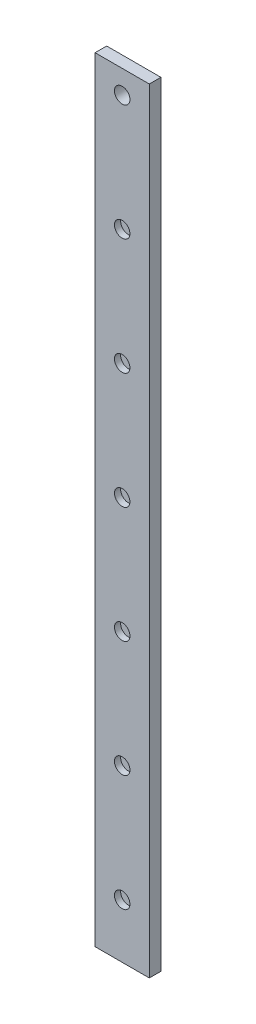
ISO-10303-21;
HEADER;
FILE_DESCRIPTION(('STEP AP214'),'2;1');
FILE_NAME('part.step','',(''),(''),'','','');
FILE_SCHEMA(('AUTOMOTIVE_DESIGN { 1 0 10303 214 1 1 1 1 }'));
ENDSEC;
DATA;
#1=APPLICATION_CONTEXT('core data for automotive mechanical design processes');
#2=APPLICATION_PROTOCOL_DEFINITION('international standard','automotive_design',2000,#1);
#3=PRODUCT_CONTEXT('',#1,'mechanical');
#4=PRODUCT('Part','Part','',(#3));
#5=PRODUCT_RELATED_PRODUCT_CATEGORY('part','',(#4));
#6=PRODUCT_DEFINITION_FORMATION('','',#4);
#7=PRODUCT_DEFINITION_CONTEXT('part definition',#1,'design');
#8=PRODUCT_DEFINITION('design','',#6,#7);
#9=PRODUCT_DEFINITION_SHAPE('','',#8);
#10=(LENGTH_UNIT() NAMED_UNIT(*) SI_UNIT(.MILLI.,.METRE.));
#11=(NAMED_UNIT(*) PLANE_ANGLE_UNIT() SI_UNIT($,.RADIAN.));
#12=(NAMED_UNIT(*) SI_UNIT($,.STERADIAN.) SOLID_ANGLE_UNIT());
#13=UNCERTAINTY_MEASURE_WITH_UNIT(LENGTH_MEASURE(1.E-05),#10,'distance_accuracy_value','');
#14=(GEOMETRIC_REPRESENTATION_CONTEXT(3) GLOBAL_UNCERTAINTY_ASSIGNED_CONTEXT((#13)) GLOBAL_UNIT_ASSIGNED_CONTEXT((#10,
#11,#12)) REPRESENTATION_CONTEXT('',''));
#15=CARTESIAN_POINT('',(0.,0.,0.));
#16=DIRECTION('',(0.,0.,1.));
#17=DIRECTION('',(1.,0.,0.));
#18=AXIS2_PLACEMENT_3D('',#15,#16,#17);
#19=CARTESIAN_POINT('',(0.,1000.,0.));
#20=DIRECTION('',(1.,0.,0.));
#21=DIRECTION('',(0.,0.,-1.));
#22=AXIS2_PLACEMENT_3D('',#19,#20,#21);
#23=PLANE('',#22);
#24=DIRECTION('',(0.,0.,1.));
#25=VECTOR('',#24,1.);
#26=CARTESIAN_POINT('',(0.,0.,0.));
#27=LINE('',#26,#25);
#28=CARTESIAN_POINT('',(0.,0.,0.));
#29=VERTEX_POINT('',#28);
#30=CARTESIAN_POINT('',(0.,0.,15.));
#31=VERTEX_POINT('',#30);
#32=EDGE_CURVE('E99',#29,#31,#27,.T.);
#33=ORIENTED_EDGE('',*,*,#32,.F.);
#34=DIRECTION('',(0.,-1.,0.));
#35=VECTOR('',#34,1.);
#36=CARTESIAN_POINT('',(0.,1000.,0.));
#37=LINE('',#36,#35);
#38=CARTESIAN_POINT('',(0.,1000.,0.));
#39=VERTEX_POINT('',#38);
#40=EDGE_CURVE('E11',#39,#29,#37,.T.);
#41=ORIENTED_EDGE('',*,*,#40,.F.);
#42=DIRECTION('',(0.,0.,1.));
#43=VECTOR('',#42,1.);
#44=CARTESIAN_POINT('',(0.,1000.,0.));
#45=LINE('',#44,#43);
#46=CARTESIAN_POINT('',(0.,1000.,15.));
#47=VERTEX_POINT('',#46);
#48=EDGE_CURVE('E93',#39,#47,#45,.T.);
#49=ORIENTED_EDGE('',*,*,#48,.T.);
#50=DIRECTION('',(0.,-1.,0.));
#51=VECTOR('',#50,1.);
#52=CARTESIAN_POINT('',(0.,1000.,15.));
#53=LINE('',#52,#51);
#54=EDGE_CURVE('E36',#47,#31,#53,.T.);
#55=ORIENTED_EDGE('',*,*,#54,.T.);
#56=EDGE_LOOP('',(#33,#41,#49,#55));
#57=FACE_BOUND('',#56,.T.);
#58=ADVANCED_FACE('F33',(#57),#23,.T.);
#59=CARTESIAN_POINT('',(0.,1000.,0.));
#60=DIRECTION('',(0.,0.,1.));
#61=DIRECTION('',(1.,0.,0.));
#62=AXIS2_PLACEMENT_3D('',#59,#60,#61);
#63=PLANE('',#62);
#64=CARTESIAN_POINT('',(-35.,970.,0.));
#65=DIRECTION('',(0.,0.,1.));
#66=DIRECTION('',(1.,0.,0.));
#67=AXIS2_PLACEMENT_3D('',#64,#65,#66);
#68=CIRCLE('',#67,10.);
#69=CARTESIAN_POINT('',(-25.,970.,0.));
#70=VERTEX_POINT('',#69);
#71=EDGE_CURVE('E103',#70,#70,#68,.T.);
#72=ORIENTED_EDGE('',*,*,#71,.T.);
#73=EDGE_LOOP('',(#72));
#74=FACE_BOUND('',#73,.T.);
#75=DIRECTION('',(-1.,0.,0.));
#76=VECTOR('',#75,1.);
#77=CARTESIAN_POINT('',(0.,0.,0.));
#78=LINE('',#77,#76);
#79=CARTESIAN_POINT('',(-70.,0.,0.));
#80=VERTEX_POINT('',#79);
#81=EDGE_CURVE('E66',#29,#80,#78,.T.);
#82=ORIENTED_EDGE('',*,*,#81,.T.);
#83=DIRECTION('',(0.,-1.,0.));
#84=VECTOR('',#83,1.);
#85=CARTESIAN_POINT('',(-70.,1000.,0.));
#86=LINE('',#85,#84);
#87=CARTESIAN_POINT('',(-70.,1000.,0.));
#88=VERTEX_POINT('',#87);
#89=EDGE_CURVE('E42',#88,#80,#86,.T.);
#90=ORIENTED_EDGE('',*,*,#89,.F.);
#91=DIRECTION('',(-1.,0.,0.));
#92=VECTOR('',#91,1.);
#93=CARTESIAN_POINT('',(0.,1000.,0.));
#94=LINE('',#93,#92);
#95=EDGE_CURVE('E83',#39,#88,#94,.T.);
#96=ORIENTED_EDGE('',*,*,#95,.F.);
#97=ORIENTED_EDGE('',*,*,#40,.T.);
#98=EDGE_LOOP('',(#82,#90,#96,#97));
#99=FACE_BOUND('',#98,.T.);
#100=ADVANCED_FACE('F110',(#74,#99),#63,.F.);
#101=CARTESIAN_POINT('',(-70.,1000.,0.));
#102=DIRECTION('',(1.,0.,0.));
#103=DIRECTION('',(0.,0.,-1.));
#104=AXIS2_PLACEMENT_3D('',#101,#102,#103);
#105=PLANE('',#104);
#106=DIRECTION('',(0.,0.,1.));
#107=VECTOR('',#106,1.);
#108=CARTESIAN_POINT('',(-70.,0.,0.));
#109=LINE('',#108,#107);
#110=CARTESIAN_POINT('',(-70.,0.,15.));
#111=VERTEX_POINT('',#110);
#112=EDGE_CURVE('E90',#80,#111,#109,.T.);
#113=ORIENTED_EDGE('',*,*,#112,.T.);
#114=DIRECTION('',(0.,-1.,0.));
#115=VECTOR('',#114,1.);
#116=CARTESIAN_POINT('',(-70.,1000.,15.));
#117=LINE('',#116,#115);
#118=CARTESIAN_POINT('',(-70.,1000.,15.));
#119=VERTEX_POINT('',#118);
#120=EDGE_CURVE('E87',#119,#111,#117,.T.);
#121=ORIENTED_EDGE('',*,*,#120,.F.);
#122=DIRECTION('',(0.,0.,1.));
#123=VECTOR('',#122,1.);
#124=CARTESIAN_POINT('',(-70.,1000.,0.));
#125=LINE('',#124,#123);
#126=EDGE_CURVE('E78',#88,#119,#125,.T.);
#127=ORIENTED_EDGE('',*,*,#126,.F.);
#128=ORIENTED_EDGE('',*,*,#89,.T.);
#129=EDGE_LOOP('',(#113,#121,#127,#128));
#130=FACE_BOUND('',#129,.T.);
#131=ADVANCED_FACE('F88',(#130),#105,.F.);
#132=CARTESIAN_POINT('',(0.,1000.,15.));
#133=DIRECTION('',(0.,0.,1.));
#134=DIRECTION('',(1.,0.,0.));
#135=AXIS2_PLACEMENT_3D('',#132,#133,#134);
#136=PLANE('',#135);
#137=CARTESIAN_POINT('',(-35.,820.,15.));
#138=DIRECTION('',(0.,0.,1.));
#139=DIRECTION('',(1.,0.,0.));
#140=AXIS2_PLACEMENT_3D('',#137,#138,#139);
#141=CIRCLE('',#140,10.);
#142=CARTESIAN_POINT('',(-25.,820.,15.));
#143=VERTEX_POINT('',#142);
#144=EDGE_CURVE('E131',#143,#143,#141,.T.);
#145=ORIENTED_EDGE('',*,*,#144,.F.);
#146=EDGE_LOOP('',(#145));
#147=FACE_BOUND('',#146,.T.);
#148=CARTESIAN_POINT('',(-34.9999999999984,670.,15.));
#149=DIRECTION('',(0.,0.,1.));
#150=DIRECTION('',(1.,0.,0.));
#151=AXIS2_PLACEMENT_3D('',#148,#149,#150);
#152=CIRCLE('',#151,10.);
#153=CARTESIAN_POINT('',(-24.9999999999984,670.,15.));
#154=VERTEX_POINT('',#153);
#155=EDGE_CURVE('E135',#154,#154,#152,.T.);
#156=ORIENTED_EDGE('',*,*,#155,.F.);
#157=EDGE_LOOP('',(#156));
#158=FACE_BOUND('',#157,.T.);
#159=CARTESIAN_POINT('',(-34.9999999999969,520.,15.));
#160=DIRECTION('',(0.,0.,1.));
#161=DIRECTION('',(1.,0.,0.));
#162=AXIS2_PLACEMENT_3D('',#159,#160,#161);
#163=CIRCLE('',#162,10.);
#164=CARTESIAN_POINT('',(-24.9999999999969,520.,15.));
#165=VERTEX_POINT('',#164);
#166=EDGE_CURVE('E139',#165,#165,#163,.T.);
#167=ORIENTED_EDGE('',*,*,#166,.F.);
#168=EDGE_LOOP('',(#167));
#169=FACE_BOUND('',#168,.T.);
#170=CARTESIAN_POINT('',(-34.9999999999953,370.,15.));
#171=DIRECTION('',(0.,0.,1.));
#172=DIRECTION('',(1.,0.,0.));
#173=AXIS2_PLACEMENT_3D('',#170,#171,#172);
#174=CIRCLE('',#173,10.);
#175=CARTESIAN_POINT('',(-24.9999999999953,370.,15.));
#176=VERTEX_POINT('',#175);
#177=EDGE_CURVE('E143',#176,#176,#174,.T.);
#178=ORIENTED_EDGE('',*,*,#177,.F.);
#179=EDGE_LOOP('',(#178));
#180=FACE_BOUND('',#179,.T.);
#181=CARTESIAN_POINT('',(-34.9999999999937,220.,15.));
#182=DIRECTION('',(0.,0.,1.));
#183=DIRECTION('',(1.,0.,0.));
#184=AXIS2_PLACEMENT_3D('',#181,#182,#183);
#185=CIRCLE('',#184,10.);
#186=CARTESIAN_POINT('',(-24.9999999999937,220.,15.));
#187=VERTEX_POINT('',#186);
#188=EDGE_CURVE('E147',#187,#187,#185,.T.);
#189=ORIENTED_EDGE('',*,*,#188,.F.);
#190=EDGE_LOOP('',(#189));
#191=FACE_BOUND('',#190,.T.);
#192=CARTESIAN_POINT('',(-34.9999999999921,70.,15.));
#193=DIRECTION('',(0.,0.,1.));
#194=DIRECTION('',(1.,0.,0.));
#195=AXIS2_PLACEMENT_3D('',#192,#193,#194);
#196=CIRCLE('',#195,10.);
#197=CARTESIAN_POINT('',(-24.9999999999921,70.,15.));
#198=VERTEX_POINT('',#197);
#199=EDGE_CURVE('E151',#198,#198,#196,.T.);
#200=ORIENTED_EDGE('',*,*,#199,.F.);
#201=EDGE_LOOP('',(#200));
#202=FACE_BOUND('',#201,.T.);
#203=CARTESIAN_POINT('',(-35.,970.,15.));
#204=DIRECTION('',(0.,0.,1.));
#205=DIRECTION('',(1.,0.,0.));
#206=AXIS2_PLACEMENT_3D('',#203,#204,#205);
#207=CIRCLE('',#206,10.);
#208=CARTESIAN_POINT('',(-25.,970.,15.));
#209=VERTEX_POINT('',#208);
#210=EDGE_CURVE('E154',#209,#209,#207,.T.);
#211=ORIENTED_EDGE('',*,*,#210,.F.);
#212=EDGE_LOOP('',(#211));
#213=FACE_BOUND('',#212,.T.);
#214=DIRECTION('',(-1.,0.,0.));
#215=VECTOR('',#214,1.);
#216=CARTESIAN_POINT('',(0.,0.,15.));
#217=LINE('',#216,#215);
#218=EDGE_CURVE('E102',#31,#111,#217,.T.);
#219=ORIENTED_EDGE('',*,*,#218,.F.);
#220=ORIENTED_EDGE('',*,*,#54,.F.);
#221=DIRECTION('',(-1.,0.,0.));
#222=VECTOR('',#221,1.);
#223=CARTESIAN_POINT('',(0.,1000.,15.));
#224=LINE('',#223,#222);
#225=EDGE_CURVE('E82',#47,#119,#224,.T.);
#226=ORIENTED_EDGE('',*,*,#225,.T.);
#227=ORIENTED_EDGE('',*,*,#120,.T.);
#228=EDGE_LOOP('',(#219,#220,#226,#227));
#229=FACE_BOUND('',#228,.T.);
#230=ADVANCED_FACE('F92',(#147,#158,#169,#180,#191,#202,#213,#229),#136,.T.);
#231=CARTESIAN_POINT('',(0.,1000.,0.));
#232=DIRECTION('',(0.,-1.,0.));
#233=DIRECTION('',(0.,0.,-1.));
#234=AXIS2_PLACEMENT_3D('',#231,#232,#233);
#235=PLANE('',#234);
#236=ORIENTED_EDGE('',*,*,#48,.F.);
#237=ORIENTED_EDGE('',*,*,#95,.T.);
#238=ORIENTED_EDGE('',*,*,#126,.T.);
#239=ORIENTED_EDGE('',*,*,#225,.F.);
#240=EDGE_LOOP('',(#236,#237,#238,#239));
#241=FACE_BOUND('',#240,.T.);
#242=ADVANCED_FACE('F81',(#241),#235,.F.);
#243=CARTESIAN_POINT('',(0.,0.,0.));
#244=DIRECTION('',(0.,-1.,0.));
#245=DIRECTION('',(0.,0.,-1.));
#246=AXIS2_PLACEMENT_3D('',#243,#244,#245);
#247=PLANE('',#246);
#248=ORIENTED_EDGE('',*,*,#32,.T.);
#249=ORIENTED_EDGE('',*,*,#218,.T.);
#250=ORIENTED_EDGE('',*,*,#112,.F.);
#251=ORIENTED_EDGE('',*,*,#81,.F.);
#252=EDGE_LOOP('',(#248,#249,#250,#251));
#253=FACE_BOUND('',#252,.T.);
#254=ADVANCED_FACE('F108',(#253),#247,.T.);
#255=CARTESIAN_POINT('',(-35.,970.,0.));
#256=DIRECTION('',(0.,0.,1.));
#257=DIRECTION('',(1.,0.,0.));
#258=AXIS2_PLACEMENT_3D('',#255,#256,#257);
#259=CYLINDRICAL_SURFACE('',#258,10.);
#260=ORIENTED_EDGE('',*,*,#71,.F.);
#261=EDGE_LOOP('',(#260));
#262=FACE_BOUND('',#261,.T.);
#263=ORIENTED_EDGE('',*,*,#210,.T.);
#264=EDGE_LOOP('',(#263));
#265=FACE_BOUND('',#264,.T.);
#266=ADVANCED_FACE('F233',(#262,#265),#259,.F.);
#267=CARTESIAN_POINT('',(-34.9999999999921,70.,7.));
#268=DIRECTION('',(0.,0.,1.));
#269=DIRECTION('',(1.,0.,0.));
#270=AXIS2_PLACEMENT_3D('',#267,#268,#269);
#271=CYLINDRICAL_SURFACE('',#270,10.);
#272=CARTESIAN_POINT('',(-34.9999999999921,70.,7.));
#273=DIRECTION('',(0.,0.,1.));
#274=DIRECTION('',(1.,0.,0.));
#275=AXIS2_PLACEMENT_3D('',#272,#273,#274);
#276=CIRCLE('',#275,10.);
#277=CARTESIAN_POINT('',(-24.9999999999921,70.,7.));
#278=VERTEX_POINT('',#277);
#279=EDGE_CURVE('E162',#278,#278,#276,.T.);
#280=ORIENTED_EDGE('',*,*,#279,.F.);
#281=EDGE_LOOP('',(#280));
#282=FACE_BOUND('',#281,.T.);
#283=ORIENTED_EDGE('',*,*,#199,.T.);
#284=EDGE_LOOP('',(#283));
#285=FACE_BOUND('',#284,.T.);
#286=ADVANCED_FACE('F229',(#282,#285),#271,.F.);
#287=CARTESIAN_POINT('',(-34.9999999999921,70.,7.));
#288=DIRECTION('',(0.,0.,1.));
#289=DIRECTION('',(1.,0.,0.));
#290=AXIS2_PLACEMENT_3D('',#287,#288,#289);
#291=PLANE('',#290);
#292=ORIENTED_EDGE('',*,*,#279,.T.);
#293=EDGE_LOOP('',(#292));
#294=FACE_BOUND('',#293,.T.);
#295=ADVANCED_FACE('F225',(#294),#291,.T.);
#296=CARTESIAN_POINT('',(-34.9999999999937,220.,7.));
#297=DIRECTION('',(0.,0.,1.));
#298=DIRECTION('',(1.,0.,0.));
#299=AXIS2_PLACEMENT_3D('',#296,#297,#298);
#300=CYLINDRICAL_SURFACE('',#299,10.);
#301=CARTESIAN_POINT('',(-34.9999999999937,220.,7.));
#302=DIRECTION('',(0.,0.,1.));
#303=DIRECTION('',(1.,0.,0.));
#304=AXIS2_PLACEMENT_3D('',#301,#302,#303);
#305=CIRCLE('',#304,10.);
#306=CARTESIAN_POINT('',(-24.9999999999937,220.,7.));
#307=VERTEX_POINT('',#306);
#308=EDGE_CURVE('E166',#307,#307,#305,.T.);
#309=ORIENTED_EDGE('',*,*,#308,.F.);
#310=EDGE_LOOP('',(#309));
#311=FACE_BOUND('',#310,.T.);
#312=ORIENTED_EDGE('',*,*,#188,.T.);
#313=EDGE_LOOP('',(#312));
#314=FACE_BOUND('',#313,.T.);
#315=ADVANCED_FACE('F221',(#311,#314),#300,.F.);
#316=CARTESIAN_POINT('',(-34.9999999999937,220.,7.));
#317=DIRECTION('',(0.,0.,1.));
#318=DIRECTION('',(1.,0.,0.));
#319=AXIS2_PLACEMENT_3D('',#316,#317,#318);
#320=PLANE('',#319);
#321=ORIENTED_EDGE('',*,*,#308,.T.);
#322=EDGE_LOOP('',(#321));
#323=FACE_BOUND('',#322,.T.);
#324=ADVANCED_FACE('F217',(#323),#320,.T.);
#325=CARTESIAN_POINT('',(-34.9999999999953,370.,7.));
#326=DIRECTION('',(0.,0.,1.));
#327=DIRECTION('',(1.,0.,0.));
#328=AXIS2_PLACEMENT_3D('',#325,#326,#327);
#329=CYLINDRICAL_SURFACE('',#328,10.);
#330=CARTESIAN_POINT('',(-34.9999999999953,370.,7.));
#331=DIRECTION('',(0.,0.,1.));
#332=DIRECTION('',(1.,0.,0.));
#333=AXIS2_PLACEMENT_3D('',#330,#331,#332);
#334=CIRCLE('',#333,10.);
#335=CARTESIAN_POINT('',(-24.9999999999953,370.,7.));
#336=VERTEX_POINT('',#335);
#337=EDGE_CURVE('E170',#336,#336,#334,.T.);
#338=ORIENTED_EDGE('',*,*,#337,.F.);
#339=EDGE_LOOP('',(#338));
#340=FACE_BOUND('',#339,.T.);
#341=ORIENTED_EDGE('',*,*,#177,.T.);
#342=EDGE_LOOP('',(#341));
#343=FACE_BOUND('',#342,.T.);
#344=ADVANCED_FACE('F213',(#340,#343),#329,.F.);
#345=CARTESIAN_POINT('',(-34.9999999999953,370.,7.));
#346=DIRECTION('',(0.,0.,1.));
#347=DIRECTION('',(1.,0.,0.));
#348=AXIS2_PLACEMENT_3D('',#345,#346,#347);
#349=PLANE('',#348);
#350=ORIENTED_EDGE('',*,*,#337,.T.);
#351=EDGE_LOOP('',(#350));
#352=FACE_BOUND('',#351,.T.);
#353=ADVANCED_FACE('F209',(#352),#349,.T.);
#354=CARTESIAN_POINT('',(-34.9999999999969,520.,7.));
#355=DIRECTION('',(0.,0.,1.));
#356=DIRECTION('',(1.,0.,0.));
#357=AXIS2_PLACEMENT_3D('',#354,#355,#356);
#358=CYLINDRICAL_SURFACE('',#357,10.);
#359=CARTESIAN_POINT('',(-34.9999999999969,520.,7.));
#360=DIRECTION('',(0.,0.,1.));
#361=DIRECTION('',(1.,0.,0.));
#362=AXIS2_PLACEMENT_3D('',#359,#360,#361);
#363=CIRCLE('',#362,10.);
#364=CARTESIAN_POINT('',(-24.9999999999969,520.,7.));
#365=VERTEX_POINT('',#364);
#366=EDGE_CURVE('E174',#365,#365,#363,.T.);
#367=ORIENTED_EDGE('',*,*,#366,.F.);
#368=EDGE_LOOP('',(#367));
#369=FACE_BOUND('',#368,.T.);
#370=ORIENTED_EDGE('',*,*,#166,.T.);
#371=EDGE_LOOP('',(#370));
#372=FACE_BOUND('',#371,.T.);
#373=ADVANCED_FACE('F205',(#369,#372),#358,.F.);
#374=CARTESIAN_POINT('',(-34.9999999999969,520.,7.));
#375=DIRECTION('',(0.,0.,1.));
#376=DIRECTION('',(1.,0.,0.));
#377=AXIS2_PLACEMENT_3D('',#374,#375,#376);
#378=PLANE('',#377);
#379=ORIENTED_EDGE('',*,*,#366,.T.);
#380=EDGE_LOOP('',(#379));
#381=FACE_BOUND('',#380,.T.);
#382=ADVANCED_FACE('F201',(#381),#378,.T.);
#383=CARTESIAN_POINT('',(-34.9999999999984,670.,7.));
#384=DIRECTION('',(0.,0.,1.));
#385=DIRECTION('',(1.,0.,0.));
#386=AXIS2_PLACEMENT_3D('',#383,#384,#385);
#387=CYLINDRICAL_SURFACE('',#386,10.);
#388=CARTESIAN_POINT('',(-34.9999999999984,670.,7.));
#389=DIRECTION('',(0.,0.,1.));
#390=DIRECTION('',(1.,0.,0.));
#391=AXIS2_PLACEMENT_3D('',#388,#389,#390);
#392=CIRCLE('',#391,10.);
#393=CARTESIAN_POINT('',(-24.9999999999984,670.,7.));
#394=VERTEX_POINT('',#393);
#395=EDGE_CURVE('E178',#394,#394,#392,.T.);
#396=ORIENTED_EDGE('',*,*,#395,.F.);
#397=EDGE_LOOP('',(#396));
#398=FACE_BOUND('',#397,.T.);
#399=ORIENTED_EDGE('',*,*,#155,.T.);
#400=EDGE_LOOP('',(#399));
#401=FACE_BOUND('',#400,.T.);
#402=ADVANCED_FACE('F194',(#398,#401),#387,.F.);
#403=CARTESIAN_POINT('',(-34.9999999999984,670.,7.));
#404=DIRECTION('',(0.,0.,1.));
#405=DIRECTION('',(1.,0.,0.));
#406=AXIS2_PLACEMENT_3D('',#403,#404,#405);
#407=PLANE('',#406);
#408=ORIENTED_EDGE('',*,*,#395,.T.);
#409=EDGE_LOOP('',(#408));
#410=FACE_BOUND('',#409,.T.);
#411=ADVANCED_FACE('F185',(#410),#407,.T.);
#412=CARTESIAN_POINT('',(-35.,820.,7.));
#413=DIRECTION('',(0.,0.,1.));
#414=DIRECTION('',(1.,0.,0.));
#415=AXIS2_PLACEMENT_3D('',#412,#413,#414);
#416=CYLINDRICAL_SURFACE('',#415,10.);
#417=CARTESIAN_POINT('',(-35.,820.,7.));
#418=DIRECTION('',(0.,0.,1.));
#419=DIRECTION('',(1.,0.,0.));
#420=AXIS2_PLACEMENT_3D('',#417,#418,#419);
#421=CIRCLE('',#420,10.);
#422=CARTESIAN_POINT('',(-25.,820.,7.));
#423=VERTEX_POINT('',#422);
#424=EDGE_CURVE('E156',#423,#423,#421,.T.);
#425=ORIENTED_EDGE('',*,*,#424,.F.);
#426=EDGE_LOOP('',(#425));
#427=FACE_BOUND('',#426,.T.);
#428=ORIENTED_EDGE('',*,*,#144,.T.);
#429=EDGE_LOOP('',(#428));
#430=FACE_BOUND('',#429,.T.);
#431=ADVANCED_FACE('F182',(#427,#430),#416,.F.);
#432=CARTESIAN_POINT('',(-35.,820.,7.));
#433=DIRECTION('',(0.,0.,1.));
#434=DIRECTION('',(1.,0.,0.));
#435=AXIS2_PLACEMENT_3D('',#432,#433,#434);
#436=PLANE('',#435);
#437=ORIENTED_EDGE('',*,*,#424,.T.);
#438=EDGE_LOOP('',(#437));
#439=FACE_BOUND('',#438,.T.);
#440=ADVANCED_FACE('F184',(#439),#436,.T.);
#441=CLOSED_SHELL('',(#58,#100,#131,#230,#242,#254,#266,#286,#295,#315,#324,#344,#353,#373,#382,
#402,#411,#431,#440));
#442=MANIFOLD_SOLID_BREP('B2',#441);
#443=ADVANCED_BREP_SHAPE_REPRESENTATION('',(#18,#442),#14);
#444=SHAPE_DEFINITION_REPRESENTATION(#9,#443);
ENDSEC;
END-ISO-10303-21;
